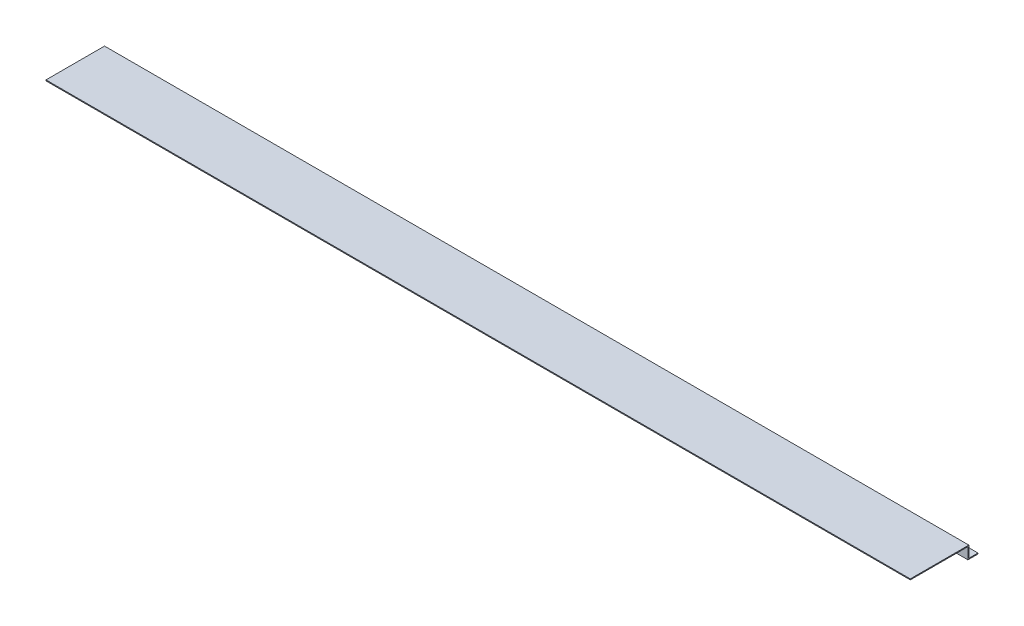
ISO-10303-21;
HEADER;
FILE_DESCRIPTION(('STEP AP214'),'2;1');
FILE_NAME('part.step','',(''),(''),'','','');
FILE_SCHEMA(('AUTOMOTIVE_DESIGN { 1 0 10303 214 1 1 1 1 }'));
ENDSEC;
DATA;
#1=APPLICATION_CONTEXT('core data for automotive mechanical design processes');
#2=APPLICATION_PROTOCOL_DEFINITION('international standard','automotive_design',2000,#1);
#3=PRODUCT_CONTEXT('',#1,'mechanical');
#4=PRODUCT('Part','Part','',(#3));
#5=PRODUCT_RELATED_PRODUCT_CATEGORY('part','',(#4));
#6=PRODUCT_DEFINITION_FORMATION('','',#4);
#7=PRODUCT_DEFINITION_CONTEXT('part definition',#1,'design');
#8=PRODUCT_DEFINITION('design','',#6,#7);
#9=PRODUCT_DEFINITION_SHAPE('','',#8);
#10=(LENGTH_UNIT() NAMED_UNIT(*) SI_UNIT(.MILLI.,.METRE.));
#11=(NAMED_UNIT(*) PLANE_ANGLE_UNIT() SI_UNIT($,.RADIAN.));
#12=(NAMED_UNIT(*) SI_UNIT($,.STERADIAN.) SOLID_ANGLE_UNIT());
#13=UNCERTAINTY_MEASURE_WITH_UNIT(LENGTH_MEASURE(1.E-05),#10,'distance_accuracy_value','');
#14=(GEOMETRIC_REPRESENTATION_CONTEXT(3) GLOBAL_UNCERTAINTY_ASSIGNED_CONTEXT((#13)) GLOBAL_UNIT_ASSIGNED_CONTEXT((#10,
#11,#12)) REPRESENTATION_CONTEXT('',''));
#15=CARTESIAN_POINT('',(0.,0.,0.));
#16=DIRECTION('',(0.,0.,1.));
#17=DIRECTION('',(1.,0.,0.));
#18=AXIS2_PLACEMENT_3D('',#15,#16,#17);
#19=CARTESIAN_POINT('',(1890.,0.,0.));
#20=DIRECTION('',(0.,0.,-1.));
#21=DIRECTION('',(-1.,0.,0.));
#22=AXIS2_PLACEMENT_3D('',#19,#20,#21);
#23=PLANE('',#22);
#24=DIRECTION('',(0.,-1.,0.));
#25=VECTOR('',#24,1.);
#26=CARTESIAN_POINT('',(0.,0.,0.));
#27=LINE('',#26,#25);
#28=CARTESIAN_POINT('',(0.,0.,0.));
#29=VERTEX_POINT('',#28);
#30=CARTESIAN_POINT('',(0.,-2.,0.));
#31=VERTEX_POINT('',#30);
#32=EDGE_CURVE('E129',#29,#31,#27,.T.);
#33=ORIENTED_EDGE('',*,*,#32,.T.);
#34=DIRECTION('',(-1.,0.,0.));
#35=VECTOR('',#34,1.);
#36=CARTESIAN_POINT('',(1890.,-2.,0.));
#37=LINE('',#36,#35);
#38=CARTESIAN_POINT('',(1890.,-2.,0.));
#39=VERTEX_POINT('',#38);
#40=EDGE_CURVE('E11',#39,#31,#37,.T.);
#41=ORIENTED_EDGE('',*,*,#40,.F.);
#42=DIRECTION('',(0.,-1.,0.));
#43=VECTOR('',#42,1.);
#44=CARTESIAN_POINT('',(1890.,0.,0.));
#45=LINE('',#44,#43);
#46=CARTESIAN_POINT('',(1890.,0.,0.));
#47=VERTEX_POINT('',#46);
#48=EDGE_CURVE('E143',#47,#39,#45,.T.);
#49=ORIENTED_EDGE('',*,*,#48,.F.);
#50=DIRECTION('',(-1.,0.,0.));
#51=VECTOR('',#50,1.);
#52=CARTESIAN_POINT('',(1890.,0.,0.));
#53=LINE('',#52,#51);
#54=EDGE_CURVE('E125',#47,#29,#53,.T.);
#55=ORIENTED_EDGE('',*,*,#54,.T.);
#56=EDGE_LOOP('',(#33,#41,#49,#55));
#57=FACE_BOUND('',#56,.T.);
#58=ADVANCED_FACE('F33',(#57),#23,.F.);
#59=CARTESIAN_POINT('',(1890.,-2.,0.));
#60=DIRECTION('',(0.,1.,0.));
#61=DIRECTION('',(0.,0.,1.));
#62=AXIS2_PLACEMENT_3D('',#59,#60,#61);
#63=PLANE('',#62);
#64=DIRECTION('',(0.,0.,-1.));
#65=VECTOR('',#64,1.);
#66=CARTESIAN_POINT('',(0.,-2.,0.));
#67=LINE('',#66,#65);
#68=CARTESIAN_POINT('',(0.,-2.,-126.));
#69=VERTEX_POINT('',#68);
#70=EDGE_CURVE('E132',#31,#69,#67,.T.);
#71=ORIENTED_EDGE('',*,*,#70,.T.);
#72=DIRECTION('',(-1.,0.,0.));
#73=VECTOR('',#72,1.);
#74=CARTESIAN_POINT('',(1890.,-2.,-126.));
#75=LINE('',#74,#73);
#76=CARTESIAN_POINT('',(1890.,-2.,-126.));
#77=VERTEX_POINT('',#76);
#78=EDGE_CURVE('E41',#77,#69,#75,.T.);
#79=ORIENTED_EDGE('',*,*,#78,.F.);
#80=DIRECTION('',(0.,0.,-1.));
#81=VECTOR('',#80,1.);
#82=CARTESIAN_POINT('',(1890.,-2.,0.));
#83=LINE('',#82,#81);
#84=EDGE_CURVE('E92',#39,#77,#83,.T.);
#85=ORIENTED_EDGE('',*,*,#84,.F.);
#86=ORIENTED_EDGE('',*,*,#40,.T.);
#87=EDGE_LOOP('',(#71,#79,#85,#86));
#88=FACE_BOUND('',#87,.T.);
#89=ADVANCED_FACE('F178',(#88),#63,.F.);
#90=CARTESIAN_POINT('',(1890.,-2.,-126.));
#91=DIRECTION('',(0.,0.,-1.));
#92=DIRECTION('',(-1.,0.,0.));
#93=AXIS2_PLACEMENT_3D('',#90,#91,#92);
#94=PLANE('',#93);
#95=DIRECTION('',(0.,-1.,0.));
#96=VECTOR('',#95,1.);
#97=CARTESIAN_POINT('',(0.,-2.,-126.));
#98=LINE('',#97,#96);
#99=CARTESIAN_POINT('',(0.,-27.,-126.));
#100=VERTEX_POINT('',#99);
#101=EDGE_CURVE('E134',#69,#100,#98,.T.);
#102=ORIENTED_EDGE('',*,*,#101,.T.);
#103=DIRECTION('',(-1.,0.,0.));
#104=VECTOR('',#103,1.);
#105=CARTESIAN_POINT('',(1890.,-27.,-126.));
#106=LINE('',#105,#104);
#107=CARTESIAN_POINT('',(1890.,-27.,-126.));
#108=VERTEX_POINT('',#107);
#109=EDGE_CURVE('E150',#108,#100,#106,.T.);
#110=ORIENTED_EDGE('',*,*,#109,.F.);
#111=DIRECTION('',(0.,-1.,0.));
#112=VECTOR('',#111,1.);
#113=CARTESIAN_POINT('',(1890.,-2.,-126.));
#114=LINE('',#113,#112);
#115=EDGE_CURVE('E158',#77,#108,#114,.T.);
#116=ORIENTED_EDGE('',*,*,#115,.F.);
#117=ORIENTED_EDGE('',*,*,#78,.T.);
#118=EDGE_LOOP('',(#102,#110,#116,#117));
#119=FACE_BOUND('',#118,.T.);
#120=ADVANCED_FACE('F156',(#119),#94,.F.);
#121=CARTESIAN_POINT('',(1890.,-27.,-126.));
#122=DIRECTION('',(0.,1.,0.));
#123=DIRECTION('',(0.,0.,1.));
#124=AXIS2_PLACEMENT_3D('',#121,#122,#123);
#125=PLANE('',#124);
#126=DIRECTION('',(0.,0.,-1.));
#127=VECTOR('',#126,1.);
#128=CARTESIAN_POINT('',(0.,-27.,-126.));
#129=LINE('',#128,#127);
#130=CARTESIAN_POINT('',(0.,-27.,-148.));
#131=VERTEX_POINT('',#130);
#132=EDGE_CURVE('E136',#100,#131,#129,.T.);
#133=ORIENTED_EDGE('',*,*,#132,.T.);
#134=DIRECTION('',(-1.,0.,0.));
#135=VECTOR('',#134,1.);
#136=CARTESIAN_POINT('',(1890.,-27.,-148.));
#137=LINE('',#136,#135);
#138=CARTESIAN_POINT('',(1890.,-27.,-148.));
#139=VERTEX_POINT('',#138);
#140=EDGE_CURVE('E147',#139,#131,#137,.T.);
#141=ORIENTED_EDGE('',*,*,#140,.F.);
#142=DIRECTION('',(0.,0.,-1.));
#143=VECTOR('',#142,1.);
#144=CARTESIAN_POINT('',(1890.,-27.,-126.));
#145=LINE('',#144,#143);
#146=EDGE_CURVE('E170',#108,#139,#145,.T.);
#147=ORIENTED_EDGE('',*,*,#146,.F.);
#148=ORIENTED_EDGE('',*,*,#109,.T.);
#149=EDGE_LOOP('',(#133,#141,#147,#148));
#150=FACE_BOUND('',#149,.T.);
#151=ADVANCED_FACE('F166',(#150),#125,.F.);
#152=CARTESIAN_POINT('',(1890.,-25.,-148.));
#153=DIRECTION('',(0.,0.,1.));
#154=DIRECTION('',(1.,0.,0.));
#155=AXIS2_PLACEMENT_3D('',#152,#153,#154);
#156=PLANE('',#155);
#157=DIRECTION('',(0.,1.,0.));
#158=VECTOR('',#157,1.);
#159=CARTESIAN_POINT('',(0.,-25.,-148.));
#160=LINE('',#159,#158);
#161=CARTESIAN_POINT('',(0.,-25.,-148.));
#162=VERTEX_POINT('',#161);
#163=EDGE_CURVE('E138',#131,#162,#160,.T.);
#164=ORIENTED_EDGE('',*,*,#163,.T.);
#165=DIRECTION('',(-1.,0.,0.));
#166=VECTOR('',#165,1.);
#167=CARTESIAN_POINT('',(1890.,-25.,-148.));
#168=LINE('',#167,#166);
#169=CARTESIAN_POINT('',(1890.,-25.,-148.));
#170=VERTEX_POINT('',#169);
#171=EDGE_CURVE('E120',#170,#162,#168,.T.);
#172=ORIENTED_EDGE('',*,*,#171,.F.);
#173=DIRECTION('',(0.,1.,0.));
#174=VECTOR('',#173,1.);
#175=CARTESIAN_POINT('',(1890.,-25.,-148.));
#176=LINE('',#175,#174);
#177=EDGE_CURVE('E111',#139,#170,#176,.T.);
#178=ORIENTED_EDGE('',*,*,#177,.F.);
#179=ORIENTED_EDGE('',*,*,#140,.T.);
#180=EDGE_LOOP('',(#164,#172,#178,#179));
#181=FACE_BOUND('',#180,.T.);
#182=ADVANCED_FACE('F169',(#181),#156,.F.);
#183=CARTESIAN_POINT('',(1890.,-25.,-128.));
#184=DIRECTION('',(0.,-1.,0.));
#185=DIRECTION('',(0.,0.,-1.));
#186=AXIS2_PLACEMENT_3D('',#183,#184,#185);
#187=PLANE('',#186);
#188=DIRECTION('',(0.,0.,1.));
#189=VECTOR('',#188,1.);
#190=CARTESIAN_POINT('',(0.,-25.,-128.));
#191=LINE('',#190,#189);
#192=CARTESIAN_POINT('',(0.,-25.,-128.));
#193=VERTEX_POINT('',#192);
#194=EDGE_CURVE('E119',#162,#193,#191,.T.);
#195=ORIENTED_EDGE('',*,*,#194,.T.);
#196=DIRECTION('',(-1.,0.,0.));
#197=VECTOR('',#196,1.);
#198=CARTESIAN_POINT('',(1890.,-25.,-128.));
#199=LINE('',#198,#197);
#200=CARTESIAN_POINT('',(1890.,-25.,-128.));
#201=VERTEX_POINT('',#200);
#202=EDGE_CURVE('E116',#201,#193,#199,.T.);
#203=ORIENTED_EDGE('',*,*,#202,.F.);
#204=DIRECTION('',(0.,0.,1.));
#205=VECTOR('',#204,1.);
#206=CARTESIAN_POINT('',(1890.,-25.,-128.));
#207=LINE('',#206,#205);
#208=EDGE_CURVE('E105',#170,#201,#207,.T.);
#209=ORIENTED_EDGE('',*,*,#208,.F.);
#210=ORIENTED_EDGE('',*,*,#171,.T.);
#211=EDGE_LOOP('',(#195,#203,#209,#210));
#212=FACE_BOUND('',#211,.T.);
#213=ADVANCED_FACE('F117',(#212),#187,.F.);
#214=CARTESIAN_POINT('',(1890.,0.,-128.));
#215=DIRECTION('',(0.,0.,1.));
#216=DIRECTION('',(1.,0.,0.));
#217=AXIS2_PLACEMENT_3D('',#214,#215,#216);
#218=PLANE('',#217);
#219=DIRECTION('',(0.,1.,0.));
#220=VECTOR('',#219,1.);
#221=CARTESIAN_POINT('',(0.,0.,-128.));
#222=LINE('',#221,#220);
#223=CARTESIAN_POINT('',(0.,0.,-128.));
#224=VERTEX_POINT('',#223);
#225=EDGE_CURVE('E78',#193,#224,#222,.T.);
#226=ORIENTED_EDGE('',*,*,#225,.T.);
#227=DIRECTION('',(-1.,0.,0.));
#228=VECTOR('',#227,1.);
#229=CARTESIAN_POINT('',(1890.,0.,-128.));
#230=LINE('',#229,#228);
#231=CARTESIAN_POINT('',(1890.,0.,-128.));
#232=VERTEX_POINT('',#231);
#233=EDGE_CURVE('E121',#232,#224,#230,.T.);
#234=ORIENTED_EDGE('',*,*,#233,.F.);
#235=DIRECTION('',(0.,1.,0.));
#236=VECTOR('',#235,1.);
#237=CARTESIAN_POINT('',(1890.,0.,-128.));
#238=LINE('',#237,#236);
#239=EDGE_CURVE('E109',#201,#232,#238,.T.);
#240=ORIENTED_EDGE('',*,*,#239,.F.);
#241=ORIENTED_EDGE('',*,*,#202,.T.);
#242=EDGE_LOOP('',(#226,#234,#240,#241));
#243=FACE_BOUND('',#242,.T.);
#244=ADVANCED_FACE('F123',(#243),#218,.F.);
#245=CARTESIAN_POINT('',(1890.,0.,0.));
#246=DIRECTION('',(0.,-1.,0.));
#247=DIRECTION('',(0.,0.,-1.));
#248=AXIS2_PLACEMENT_3D('',#245,#246,#247);
#249=PLANE('',#248);
#250=DIRECTION('',(0.,0.,1.));
#251=VECTOR('',#250,1.);
#252=CARTESIAN_POINT('',(0.,0.,0.));
#253=LINE('',#252,#251);
#254=EDGE_CURVE('E84',#224,#29,#253,.T.);
#255=ORIENTED_EDGE('',*,*,#254,.T.);
#256=ORIENTED_EDGE('',*,*,#54,.F.);
#257=DIRECTION('',(0.,0.,1.));
#258=VECTOR('',#257,1.);
#259=CARTESIAN_POINT('',(1890.,0.,0.));
#260=LINE('',#259,#258);
#261=EDGE_CURVE('E49',#232,#47,#260,.T.);
#262=ORIENTED_EDGE('',*,*,#261,.F.);
#263=ORIENTED_EDGE('',*,*,#233,.T.);
#264=EDGE_LOOP('',(#255,#256,#262,#263));
#265=FACE_BOUND('',#264,.T.);
#266=ADVANCED_FACE('F194',(#265),#249,.F.);
#267=CARTESIAN_POINT('',(1890.,0.,0.));
#268=DIRECTION('',(1.,0.,0.));
#269=DIRECTION('',(0.,0.,-1.));
#270=AXIS2_PLACEMENT_3D('',#267,#268,#269);
#271=PLANE('',#270);
#272=ORIENTED_EDGE('',*,*,#48,.T.);
#273=ORIENTED_EDGE('',*,*,#84,.T.);
#274=ORIENTED_EDGE('',*,*,#115,.T.);
#275=ORIENTED_EDGE('',*,*,#146,.T.);
#276=ORIENTED_EDGE('',*,*,#177,.T.);
#277=ORIENTED_EDGE('',*,*,#208,.T.);
#278=ORIENTED_EDGE('',*,*,#239,.T.);
#279=ORIENTED_EDGE('',*,*,#261,.T.);
#280=EDGE_LOOP('',(#272,#273,#274,#275,#276,#277,#278,#279));
#281=FACE_BOUND('',#280,.T.);
#282=ADVANCED_FACE('F107',(#281),#271,.T.);
#283=CARTESIAN_POINT('',(0.,0.,0.));
#284=DIRECTION('',(1.,0.,0.));
#285=DIRECTION('',(0.,0.,-1.));
#286=AXIS2_PLACEMENT_3D('',#283,#284,#285);
#287=PLANE('',#286);
#288=ORIENTED_EDGE('',*,*,#32,.F.);
#289=ORIENTED_EDGE('',*,*,#254,.F.);
#290=ORIENTED_EDGE('',*,*,#225,.F.);
#291=ORIENTED_EDGE('',*,*,#194,.F.);
#292=ORIENTED_EDGE('',*,*,#163,.F.);
#293=ORIENTED_EDGE('',*,*,#132,.F.);
#294=ORIENTED_EDGE('',*,*,#101,.F.);
#295=ORIENTED_EDGE('',*,*,#70,.F.);
#296=EDGE_LOOP('',(#288,#289,#290,#291,#292,#293,#294,#295));
#297=FACE_BOUND('',#296,.T.);
#298=ADVANCED_FACE('F162',(#297),#287,.F.);
#299=CLOSED_SHELL('',(#58,#89,#120,#151,#182,#213,#244,#266,#282,#298));
#300=MANIFOLD_SOLID_BREP('B2',#299);
#301=ADVANCED_BREP_SHAPE_REPRESENTATION('',(#18,#300),#14);
#302=SHAPE_DEFINITION_REPRESENTATION(#9,#301);
ENDSEC;
END-ISO-10303-21;
